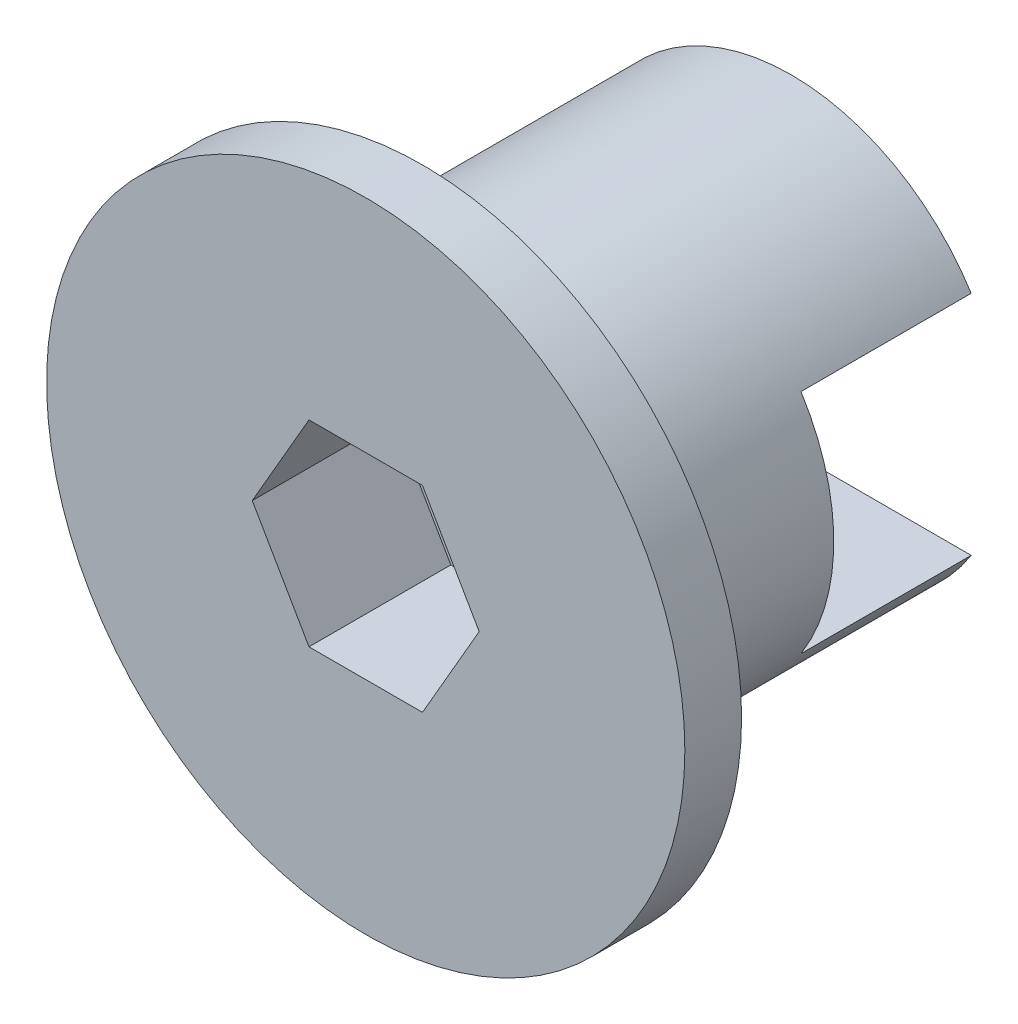
ISO-10303-21;
HEADER;
FILE_DESCRIPTION(('STEP AP214'),'2;1');
FILE_NAME('part.step','',(''),(''),'','','');
FILE_SCHEMA(('AUTOMOTIVE_DESIGN { 1 0 10303 214 1 1 1 1 }'));
ENDSEC;
DATA;
#1=APPLICATION_CONTEXT('core data for automotive mechanical design processes');
#2=APPLICATION_PROTOCOL_DEFINITION('international standard','automotive_design',2000,#1);
#3=PRODUCT_CONTEXT('',#1,'mechanical');
#4=PRODUCT('Part','Part','',(#3));
#5=PRODUCT_RELATED_PRODUCT_CATEGORY('part','',(#4));
#6=PRODUCT_DEFINITION_FORMATION('','',#4);
#7=PRODUCT_DEFINITION_CONTEXT('part definition',#1,'design');
#8=PRODUCT_DEFINITION('design','',#6,#7);
#9=PRODUCT_DEFINITION_SHAPE('','',#8);
#10=(LENGTH_UNIT() NAMED_UNIT(*) SI_UNIT(.MILLI.,.METRE.));
#11=(NAMED_UNIT(*) PLANE_ANGLE_UNIT() SI_UNIT($,.RADIAN.));
#12=(NAMED_UNIT(*) SI_UNIT($,.STERADIAN.) SOLID_ANGLE_UNIT());
#13=UNCERTAINTY_MEASURE_WITH_UNIT(LENGTH_MEASURE(1.E-05),#10,'distance_accuracy_value','');
#14=(GEOMETRIC_REPRESENTATION_CONTEXT(3) GLOBAL_UNCERTAINTY_ASSIGNED_CONTEXT((#13)) GLOBAL_UNIT_ASSIGNED_CONTEXT((#10,
#11,#12)) REPRESENTATION_CONTEXT('',''));
#15=CARTESIAN_POINT('',(0.,0.,0.));
#16=DIRECTION('',(0.,0.,1.));
#17=DIRECTION('',(1.,0.,0.));
#18=AXIS2_PLACEMENT_3D('',#15,#16,#17);
#19=CARTESIAN_POINT('',(0.,0.,30.));
#20=DIRECTION('',(0.,0.,-1.));
#21=DIRECTION('',(-1.,0.,0.));
#22=AXIS2_PLACEMENT_3D('',#19,#20,#21);
#23=CYLINDRICAL_SURFACE('',#22,15.);
#24=CARTESIAN_POINT('',(0.,0.,12.));
#25=DIRECTION('',(0.,0.,1.));
#26=DIRECTION('',(1.,0.,0.));
#27=AXIS2_PLACEMENT_3D('',#24,#25,#26);
#28=CIRCLE('',#27,15.);
#29=CARTESIAN_POINT('',(12.6885775404495,-8.,12.));
#30=VERTEX_POINT('',#29);
#31=CARTESIAN_POINT('',(12.6885775404495,8.,12.));
#32=VERTEX_POINT('',#31);
#33=EDGE_CURVE('E112',#30,#32,#28,.T.);
#34=ORIENTED_EDGE('',*,*,#33,.T.);
#35=DIRECTION('',(0.,0.,-1.));
#36=VECTOR('',#35,1.);
#37=CARTESIAN_POINT('',(12.6885775404495,8.,30.));
#38=LINE('',#37,#36);
#39=CARTESIAN_POINT('',(12.6885775404495,8.,0.));
#40=VERTEX_POINT('',#39);
#41=EDGE_CURVE('E41',#32,#40,#38,.T.);
#42=ORIENTED_EDGE('',*,*,#41,.T.);
#43=CARTESIAN_POINT('',(0.,0.,0.));
#44=DIRECTION('',(0.,0.,1.));
#45=DIRECTION('',(1.,0.,0.));
#46=AXIS2_PLACEMENT_3D('',#43,#44,#45);
#47=CIRCLE('',#46,15.);
#48=CARTESIAN_POINT('',(-12.6885775404495,8.,0.));
#49=VERTEX_POINT('',#48);
#50=EDGE_CURVE('E120',#40,#49,#47,.T.);
#51=ORIENTED_EDGE('',*,*,#50,.T.);
#52=DIRECTION('',(0.,0.,-1.));
#53=VECTOR('',#52,1.);
#54=CARTESIAN_POINT('',(-12.6885775404495,8.,30.));
#55=LINE('',#54,#53);
#56=CARTESIAN_POINT('',(-12.6885775404495,8.,12.));
#57=VERTEX_POINT('',#56);
#58=EDGE_CURVE('E128',#49,#57,#55,.F.);
#59=ORIENTED_EDGE('',*,*,#58,.T.);
#60=CARTESIAN_POINT('',(-12.6885775404495,-8.,12.));
#61=VERTEX_POINT('',#60);
#62=EDGE_CURVE('E48',#57,#61,#28,.T.);
#63=ORIENTED_EDGE('',*,*,#62,.T.);
#64=DIRECTION('',(0.,0.,-1.));
#65=VECTOR('',#64,1.);
#66=CARTESIAN_POINT('',(-12.6885775404495,-8.,30.));
#67=LINE('',#66,#65);
#68=CARTESIAN_POINT('',(-12.6885775404495,-8.,0.));
#69=VERTEX_POINT('',#68);
#70=EDGE_CURVE('E193',#61,#69,#67,.T.);
#71=ORIENTED_EDGE('',*,*,#70,.T.);
#72=CARTESIAN_POINT('',(12.6885775404495,-8.,0.));
#73=VERTEX_POINT('',#72);
#74=EDGE_CURVE('E188',#69,#73,#47,.T.);
#75=ORIENTED_EDGE('',*,*,#74,.T.);
#76=DIRECTION('',(0.,0.,-1.));
#77=VECTOR('',#76,1.);
#78=CARTESIAN_POINT('',(12.6885775404495,-8.,30.));
#79=LINE('',#78,#77);
#80=EDGE_CURVE('E118',#73,#30,#79,.F.);
#81=ORIENTED_EDGE('',*,*,#80,.T.);
#82=EDGE_LOOP('',(#34,#42,#51,#59,#63,#71,#75,#81));
#83=FACE_BOUND('',#82,.T.);
#84=CARTESIAN_POINT('',(0.,0.,26.));
#85=DIRECTION('',(0.,0.,1.));
#86=DIRECTION('',(1.,0.,0.));
#87=AXIS2_PLACEMENT_3D('',#84,#85,#86);
#88=CIRCLE('',#87,15.);
#89=CARTESIAN_POINT('',(15.,0.,26.));
#90=VERTEX_POINT('',#89);
#91=EDGE_CURVE('E11',#90,#90,#88,.T.);
#92=ORIENTED_EDGE('',*,*,#91,.F.);
#93=EDGE_LOOP('',(#92));
#94=FACE_BOUND('',#93,.T.);
#95=ADVANCED_FACE('F34',(#83,#94),#23,.T.);
#96=CARTESIAN_POINT('',(0.,0.,0.));
#97=DIRECTION('',(0.,0.,1.));
#98=DIRECTION('',(1.,0.,0.));
#99=AXIS2_PLACEMENT_3D('',#96,#97,#98);
#100=PLANE('',#99);
#101=ORIENTED_EDGE('',*,*,#74,.F.);
#102=DIRECTION('',(1.,0.,0.));
#103=VECTOR('',#102,1.);
#104=CARTESIAN_POINT('',(-15.,-8.,0.));
#105=LINE('',#104,#103);
#106=EDGE_CURVE('E132',#69,#73,#105,.T.);
#107=ORIENTED_EDGE('',*,*,#106,.T.);
#108=EDGE_LOOP('',(#101,#107));
#109=FACE_BOUND('',#108,.T.);
#110=ADVANCED_FACE('F201',(#109),#100,.F.);
#111=CARTESIAN_POINT('',(0.,0.,30.));
#112=DIRECTION('',(0.,0.,-1.));
#113=DIRECTION('',(-1.,0.,0.));
#114=AXIS2_PLACEMENT_3D('',#111,#112,#113);
#115=CYLINDRICAL_SURFACE('',#114,5.);
#116=CARTESIAN_POINT('',(0.,0.,12.));
#117=DIRECTION('',(0.,0.,1.));
#118=DIRECTION('',(1.,0.,0.));
#119=AXIS2_PLACEMENT_3D('',#116,#117,#118);
#120=CIRCLE('',#119,5.);
#121=CARTESIAN_POINT('',(5.,0.,12.));
#122=VERTEX_POINT('',#121);
#123=EDGE_CURVE('E138',#122,#122,#120,.T.);
#124=ORIENTED_EDGE('',*,*,#123,.F.);
#125=EDGE_LOOP('',(#124));
#126=FACE_BOUND('',#125,.T.);
#127=CARTESIAN_POINT('',(0.,0.,20.));
#128=DIRECTION('',(0.,0.,1.));
#129=DIRECTION('',(1.,0.,0.));
#130=AXIS2_PLACEMENT_3D('',#127,#128,#129);
#131=CIRCLE('',#130,5.);
#132=CARTESIAN_POINT('',(5.,0.,20.));
#133=VERTEX_POINT('',#132);
#134=EDGE_CURVE('E178',#133,#133,#131,.T.);
#135=ORIENTED_EDGE('',*,*,#134,.T.);
#136=EDGE_LOOP('',(#135));
#137=FACE_BOUND('',#136,.T.);
#138=ADVANCED_FACE('F208',(#126,#137),#115,.F.);
#139=CARTESIAN_POINT('',(0.,0.,30.));
#140=DIRECTION('',(0.,0.,1.));
#141=DIRECTION('',(1.,0.,0.));
#142=AXIS2_PLACEMENT_3D('',#139,#140,#141);
#143=PLANE('',#142);
#144=DIRECTION('',(0.5,0.866025403784439,0.));
#145=VECTOR('',#144,1.);
#146=CARTESIAN_POINT('',(4.,-6.92820323027551,30.));
#147=LINE('',#146,#145);
#148=CARTESIAN_POINT('',(4.,-6.92820323027551,30.));
#149=VERTEX_POINT('',#148);
#150=CARTESIAN_POINT('',(8.,0.,30.));
#151=VERTEX_POINT('',#150);
#152=EDGE_CURVE('E56',#149,#151,#147,.T.);
#153=ORIENTED_EDGE('',*,*,#152,.F.);
#154=DIRECTION('',(1.,0.,0.));
#155=VECTOR('',#154,1.);
#156=CARTESIAN_POINT('',(-4.,-6.92820323027551,30.));
#157=LINE('',#156,#155);
#158=CARTESIAN_POINT('',(-4.,-6.92820323027551,30.));
#159=VERTEX_POINT('',#158);
#160=EDGE_CURVE('E145',#159,#149,#157,.T.);
#161=ORIENTED_EDGE('',*,*,#160,.F.);
#162=DIRECTION('',(0.5,-0.866025403784439,0.));
#163=VECTOR('',#162,1.);
#164=CARTESIAN_POINT('',(-8.,0.,30.));
#165=LINE('',#164,#163);
#166=CARTESIAN_POINT('',(-8.,0.,30.));
#167=VERTEX_POINT('',#166);
#168=EDGE_CURVE('E171',#167,#159,#165,.T.);
#169=ORIENTED_EDGE('',*,*,#168,.F.);
#170=DIRECTION('',(-0.5,-0.866025403784439,0.));
#171=VECTOR('',#170,1.);
#172=CARTESIAN_POINT('',(-4.,6.92820323027551,30.));
#173=LINE('',#172,#171);
#174=CARTESIAN_POINT('',(-4.,6.92820323027551,30.));
#175=VERTEX_POINT('',#174);
#176=EDGE_CURVE('E168',#175,#167,#173,.T.);
#177=ORIENTED_EDGE('',*,*,#176,.F.);
#178=DIRECTION('',(-1.,0.,0.));
#179=VECTOR('',#178,1.);
#180=CARTESIAN_POINT('',(4.,6.92820323027551,30.));
#181=LINE('',#180,#179);
#182=CARTESIAN_POINT('',(4.,6.92820323027551,30.));
#183=VERTEX_POINT('',#182);
#184=EDGE_CURVE('E165',#183,#175,#181,.T.);
#185=ORIENTED_EDGE('',*,*,#184,.F.);
#186=DIRECTION('',(-0.5,0.866025403784438,0.));
#187=VECTOR('',#186,1.);
#188=CARTESIAN_POINT('',(8.,0.,30.));
#189=LINE('',#188,#187);
#190=EDGE_CURVE('E162',#151,#183,#189,.T.);
#191=ORIENTED_EDGE('',*,*,#190,.F.);
#192=EDGE_LOOP('',(#153,#161,#169,#177,#185,#191));
#193=FACE_BOUND('',#192,.T.);
#194=CARTESIAN_POINT('',(0.,0.,30.));
#195=DIRECTION('',(0.,0.,1.));
#196=DIRECTION('',(1.,0.,0.));
#197=AXIS2_PLACEMENT_3D('',#194,#195,#196);
#198=CIRCLE('',#197,22.5);
#199=CARTESIAN_POINT('',(22.5,0.,30.));
#200=VERTEX_POINT('',#199);
#201=EDGE_CURVE('E308',#200,#200,#198,.T.);
#202=ORIENTED_EDGE('',*,*,#201,.T.);
#203=EDGE_LOOP('',(#202));
#204=FACE_BOUND('',#203,.T.);
#205=ADVANCED_FACE('F200',(#193,#204),#143,.T.);
#206=ORIENTED_EDGE('',*,*,#50,.F.);
#207=DIRECTION('',(1.,0.,0.));
#208=VECTOR('',#207,1.);
#209=CARTESIAN_POINT('',(-15.,8.,0.));
#210=LINE('',#209,#208);
#211=EDGE_CURVE('E127',#49,#40,#210,.T.);
#212=ORIENTED_EDGE('',*,*,#211,.F.);
#213=EDGE_LOOP('',(#206,#212));
#214=FACE_BOUND('',#213,.T.);
#215=ADVANCED_FACE('F197',(#214),#100,.F.);
#216=CARTESIAN_POINT('',(4.,-6.92820323027551,20.));
#217=DIRECTION('',(0.866025403784439,-0.5,0.));
#218=DIRECTION('',(0.5,0.866025403784439,0.));
#219=AXIS2_PLACEMENT_3D('',#216,#217,#218);
#220=PLANE('',#219);
#221=ORIENTED_EDGE('',*,*,#152,.T.);
#222=DIRECTION('',(0.,0.,1.));
#223=VECTOR('',#222,1.);
#224=CARTESIAN_POINT('',(8.,0.,20.));
#225=LINE('',#224,#223);
#226=CARTESIAN_POINT('',(8.,0.,20.));
#227=VERTEX_POINT('',#226);
#228=EDGE_CURVE('E160',#227,#151,#225,.T.);
#229=ORIENTED_EDGE('',*,*,#228,.F.);
#230=DIRECTION('',(0.5,0.866025403784439,0.));
#231=VECTOR('',#230,1.);
#232=CARTESIAN_POINT('',(4.,-6.92820323027551,20.));
#233=LINE('',#232,#231);
#234=CARTESIAN_POINT('',(4.,-6.92820323027551,20.));
#235=VERTEX_POINT('',#234);
#236=EDGE_CURVE('E141',#235,#227,#233,.T.);
#237=ORIENTED_EDGE('',*,*,#236,.F.);
#238=DIRECTION('',(0.,0.,1.));
#239=VECTOR('',#238,1.);
#240=CARTESIAN_POINT('',(4.,-6.92820323027551,20.));
#241=LINE('',#240,#239);
#242=EDGE_CURVE('E176',#235,#149,#241,.T.);
#243=ORIENTED_EDGE('',*,*,#242,.T.);
#244=EDGE_LOOP('',(#221,#229,#237,#243));
#245=FACE_BOUND('',#244,.T.);
#246=ADVANCED_FACE('F199',(#245),#220,.F.);
#247=CARTESIAN_POINT('',(-4.,-6.92820323027551,20.));
#248=DIRECTION('',(0.,-1.,0.));
#249=DIRECTION('',(0.,0.,-1.));
#250=AXIS2_PLACEMENT_3D('',#247,#248,#249);
#251=PLANE('',#250);
#252=ORIENTED_EDGE('',*,*,#160,.T.);
#253=ORIENTED_EDGE('',*,*,#242,.F.);
#254=DIRECTION('',(1.,0.,0.));
#255=VECTOR('',#254,1.);
#256=CARTESIAN_POINT('',(-4.,-6.92820323027551,20.));
#257=LINE('',#256,#255);
#258=CARTESIAN_POINT('',(-4.,-6.92820323027551,20.));
#259=VERTEX_POINT('',#258);
#260=EDGE_CURVE('E157',#259,#235,#257,.T.);
#261=ORIENTED_EDGE('',*,*,#260,.F.);
#262=DIRECTION('',(0.,0.,1.));
#263=VECTOR('',#262,1.);
#264=CARTESIAN_POINT('',(-4.,-6.92820323027551,20.));
#265=LINE('',#264,#263);
#266=EDGE_CURVE('E179',#259,#159,#265,.T.);
#267=ORIENTED_EDGE('',*,*,#266,.T.);
#268=EDGE_LOOP('',(#252,#253,#261,#267));
#269=FACE_BOUND('',#268,.T.);
#270=ADVANCED_FACE('F206',(#269),#251,.F.);
#271=CARTESIAN_POINT('',(-8.,0.,20.));
#272=DIRECTION('',(-0.866025403784439,-0.5,0.));
#273=DIRECTION('',(0.5,-0.866025403784439,0.));
#274=AXIS2_PLACEMENT_3D('',#271,#272,#273);
#275=PLANE('',#274);
#276=ORIENTED_EDGE('',*,*,#168,.T.);
#277=ORIENTED_EDGE('',*,*,#266,.F.);
#278=DIRECTION('',(0.5,-0.866025403784439,0.));
#279=VECTOR('',#278,1.);
#280=CARTESIAN_POINT('',(-8.,0.,20.));
#281=LINE('',#280,#279);
#282=CARTESIAN_POINT('',(-8.,0.,20.));
#283=VERTEX_POINT('',#282);
#284=EDGE_CURVE('E154',#283,#259,#281,.T.);
#285=ORIENTED_EDGE('',*,*,#284,.F.);
#286=DIRECTION('',(0.,0.,1.));
#287=VECTOR('',#286,1.);
#288=CARTESIAN_POINT('',(-8.,0.,20.));
#289=LINE('',#288,#287);
#290=EDGE_CURVE('E181',#283,#167,#289,.T.);
#291=ORIENTED_EDGE('',*,*,#290,.T.);
#292=EDGE_LOOP('',(#276,#277,#285,#291));
#293=FACE_BOUND('',#292,.T.);
#294=ADVANCED_FACE('F276',(#293),#275,.F.);
#295=CARTESIAN_POINT('',(-4.,6.92820323027551,20.));
#296=DIRECTION('',(-0.866025403784439,0.5,0.));
#297=DIRECTION('',(-0.5,-0.866025403784439,0.));
#298=AXIS2_PLACEMENT_3D('',#295,#296,#297);
#299=PLANE('',#298);
#300=ORIENTED_EDGE('',*,*,#176,.T.);
#301=ORIENTED_EDGE('',*,*,#290,.F.);
#302=DIRECTION('',(-0.5,-0.866025403784439,0.));
#303=VECTOR('',#302,1.);
#304=CARTESIAN_POINT('',(-4.,6.92820323027551,20.));
#305=LINE('',#304,#303);
#306=CARTESIAN_POINT('',(-4.,6.92820323027551,20.));
#307=VERTEX_POINT('',#306);
#308=EDGE_CURVE('E151',#307,#283,#305,.T.);
#309=ORIENTED_EDGE('',*,*,#308,.F.);
#310=DIRECTION('',(0.,0.,1.));
#311=VECTOR('',#310,1.);
#312=CARTESIAN_POINT('',(-4.,6.92820323027551,20.));
#313=LINE('',#312,#311);
#314=EDGE_CURVE('E183',#307,#175,#313,.T.);
#315=ORIENTED_EDGE('',*,*,#314,.T.);
#316=EDGE_LOOP('',(#300,#301,#309,#315));
#317=FACE_BOUND('',#316,.T.);
#318=ADVANCED_FACE('F280',(#317),#299,.F.);
#319=CARTESIAN_POINT('',(4.,6.92820323027551,20.));
#320=DIRECTION('',(0.,1.,0.));
#321=DIRECTION('',(0.,0.,1.));
#322=AXIS2_PLACEMENT_3D('',#319,#320,#321);
#323=PLANE('',#322);
#324=ORIENTED_EDGE('',*,*,#184,.T.);
#325=ORIENTED_EDGE('',*,*,#314,.F.);
#326=DIRECTION('',(-1.,0.,0.));
#327=VECTOR('',#326,1.);
#328=CARTESIAN_POINT('',(4.,6.92820323027551,20.));
#329=LINE('',#328,#327);
#330=CARTESIAN_POINT('',(4.,6.92820323027551,20.));
#331=VERTEX_POINT('',#330);
#332=EDGE_CURVE('E148',#331,#307,#329,.T.);
#333=ORIENTED_EDGE('',*,*,#332,.F.);
#334=DIRECTION('',(0.,0.,1.));
#335=VECTOR('',#334,1.);
#336=CARTESIAN_POINT('',(4.,6.92820323027551,20.));
#337=LINE('',#336,#335);
#338=EDGE_CURVE('E185',#331,#183,#337,.T.);
#339=ORIENTED_EDGE('',*,*,#338,.T.);
#340=EDGE_LOOP('',(#324,#325,#333,#339));
#341=FACE_BOUND('',#340,.T.);
#342=ADVANCED_FACE('F284',(#341),#323,.F.);
#343=CARTESIAN_POINT('',(8.,0.,20.));
#344=DIRECTION('',(0.866025403784438,0.5,0.));
#345=DIRECTION('',(-0.5,0.866025403784438,0.));
#346=AXIS2_PLACEMENT_3D('',#343,#344,#345);
#347=PLANE('',#346);
#348=ORIENTED_EDGE('',*,*,#190,.T.);
#349=ORIENTED_EDGE('',*,*,#338,.F.);
#350=DIRECTION('',(-0.5,0.866025403784438,0.));
#351=VECTOR('',#350,1.);
#352=CARTESIAN_POINT('',(8.,0.,20.));
#353=LINE('',#352,#351);
#354=EDGE_CURVE('E144',#227,#331,#353,.T.);
#355=ORIENTED_EDGE('',*,*,#354,.F.);
#356=ORIENTED_EDGE('',*,*,#228,.T.);
#357=EDGE_LOOP('',(#348,#349,#355,#356));
#358=FACE_BOUND('',#357,.T.);
#359=ADVANCED_FACE('F272',(#358),#347,.F.);
#360=CARTESIAN_POINT('',(0.,0.,20.));
#361=DIRECTION('',(0.,0.,1.));
#362=DIRECTION('',(1.,0.,0.));
#363=AXIS2_PLACEMENT_3D('',#360,#361,#362);
#364=PLANE('',#363);
#365=ORIENTED_EDGE('',*,*,#134,.F.);
#366=EDGE_LOOP('',(#365));
#367=FACE_BOUND('',#366,.T.);
#368=ORIENTED_EDGE('',*,*,#236,.T.);
#369=ORIENTED_EDGE('',*,*,#354,.T.);
#370=ORIENTED_EDGE('',*,*,#332,.T.);
#371=ORIENTED_EDGE('',*,*,#308,.T.);
#372=ORIENTED_EDGE('',*,*,#284,.T.);
#373=ORIENTED_EDGE('',*,*,#260,.T.);
#374=EDGE_LOOP('',(#368,#369,#370,#371,#372,#373));
#375=FACE_BOUND('',#374,.T.);
#376=ADVANCED_FACE('F264',(#367,#375),#364,.T.);
#377=CARTESIAN_POINT('',(-15.,-8.,0.));
#378=DIRECTION('',(0.,-1.,0.));
#379=DIRECTION('',(0.,0.,-1.));
#380=AXIS2_PLACEMENT_3D('',#377,#378,#379);
#381=PLANE('',#380);
#382=DIRECTION('',(1.,0.,0.));
#383=VECTOR('',#382,1.);
#384=CARTESIAN_POINT('',(-15.,-8.,12.));
#385=LINE('',#384,#383);
#386=EDGE_CURVE('E130',#61,#30,#385,.T.);
#387=ORIENTED_EDGE('',*,*,#386,.T.);
#388=ORIENTED_EDGE('',*,*,#80,.F.);
#389=ORIENTED_EDGE('',*,*,#106,.F.);
#390=ORIENTED_EDGE('',*,*,#70,.F.);
#391=EDGE_LOOP('',(#387,#388,#389,#390));
#392=FACE_BOUND('',#391,.T.);
#393=ADVANCED_FACE('F261',(#392),#381,.F.);
#394=CARTESIAN_POINT('',(-15.,8.,12.));
#395=DIRECTION('',(0.,0.,1.));
#396=DIRECTION('',(1.,0.,0.));
#397=AXIS2_PLACEMENT_3D('',#394,#395,#396);
#398=PLANE('',#397);
#399=ORIENTED_EDGE('',*,*,#123,.T.);
#400=EDGE_LOOP('',(#399));
#401=FACE_BOUND('',#400,.T.);
#402=DIRECTION('',(1.,0.,0.));
#403=VECTOR('',#402,1.);
#404=CARTESIAN_POINT('',(-15.,8.,12.));
#405=LINE('',#404,#403);
#406=EDGE_CURVE('E124',#57,#32,#405,.T.);
#407=ORIENTED_EDGE('',*,*,#406,.T.);
#408=ORIENTED_EDGE('',*,*,#33,.F.);
#409=ORIENTED_EDGE('',*,*,#386,.F.);
#410=ORIENTED_EDGE('',*,*,#62,.F.);
#411=EDGE_LOOP('',(#407,#408,#409,#410));
#412=FACE_BOUND('',#411,.T.);
#413=ADVANCED_FACE('F129',(#401,#412),#398,.F.);
#414=CARTESIAN_POINT('',(-15.,8.,0.));
#415=DIRECTION('',(0.,1.,0.));
#416=DIRECTION('',(0.,0.,1.));
#417=AXIS2_PLACEMENT_3D('',#414,#415,#416);
#418=PLANE('',#417);
#419=ORIENTED_EDGE('',*,*,#406,.F.);
#420=ORIENTED_EDGE('',*,*,#58,.F.);
#421=ORIENTED_EDGE('',*,*,#211,.T.);
#422=ORIENTED_EDGE('',*,*,#41,.F.);
#423=EDGE_LOOP('',(#419,#420,#421,#422));
#424=FACE_BOUND('',#423,.T.);
#425=ADVANCED_FACE('F123',(#424),#418,.F.);
#426=CARTESIAN_POINT('',(0.,0.,26.));
#427=DIRECTION('',(0.,0.,1.));
#428=DIRECTION('',(1.,0.,0.));
#429=AXIS2_PLACEMENT_3D('',#426,#427,#428);
#430=CYLINDRICAL_SURFACE('',#429,22.5);
#431=CARTESIAN_POINT('',(0.,0.,26.));
#432=DIRECTION('',(0.,0.,1.));
#433=DIRECTION('',(1.,0.,0.));
#434=AXIS2_PLACEMENT_3D('',#431,#432,#433);
#435=CIRCLE('',#434,22.5);
#436=CARTESIAN_POINT('',(22.5,0.,26.));
#437=VERTEX_POINT('',#436);
#438=EDGE_CURVE('E134',#437,#437,#435,.T.);
#439=ORIENTED_EDGE('',*,*,#438,.T.);
#440=EDGE_LOOP('',(#439));
#441=FACE_BOUND('',#440,.T.);
#442=ORIENTED_EDGE('',*,*,#201,.F.);
#443=EDGE_LOOP('',(#442));
#444=FACE_BOUND('',#443,.T.);
#445=ADVANCED_FACE('F240',(#441,#444),#430,.T.);
#446=CARTESIAN_POINT('',(0.,0.,26.));
#447=DIRECTION('',(0.,0.,1.));
#448=DIRECTION('',(1.,0.,0.));
#449=AXIS2_PLACEMENT_3D('',#446,#447,#448);
#450=PLANE('',#449);
#451=ORIENTED_EDGE('',*,*,#91,.T.);
#452=EDGE_LOOP('',(#451));
#453=FACE_BOUND('',#452,.T.);
#454=ORIENTED_EDGE('',*,*,#438,.F.);
#455=EDGE_LOOP('',(#454));
#456=FACE_BOUND('',#455,.T.);
#457=ADVANCED_FACE('F244',(#453,#456),#450,.F.);
#458=CLOSED_SHELL('',(#95,#110,#138,#205,#215,#246,#270,#294,#318,#342,#359,#376,#393,#413,#425,
#445,#457));
#459=MANIFOLD_SOLID_BREP('B2',#458);
#460=ADVANCED_BREP_SHAPE_REPRESENTATION('',(#18,#459),#14);
#461=SHAPE_DEFINITION_REPRESENTATION(#9,#460);
ENDSEC;
END-ISO-10303-21;
